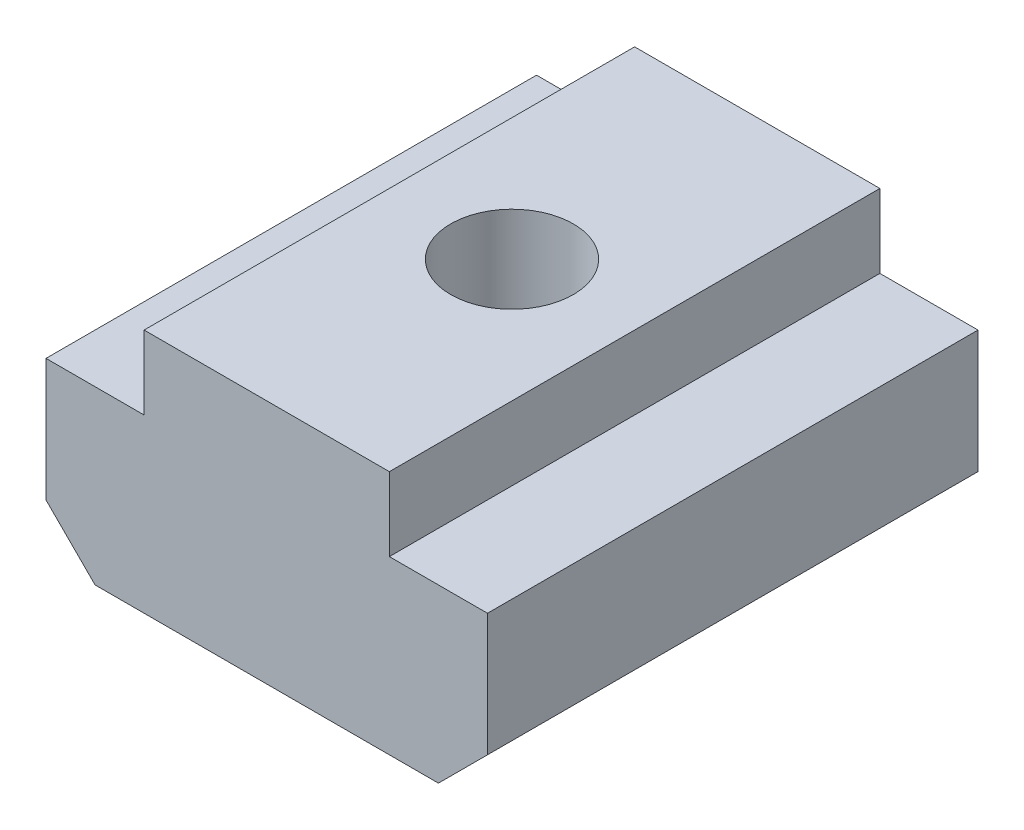
ISO-10303-21;
HEADER;
FILE_DESCRIPTION(('STEP AP214'),'2;1');
FILE_NAME('part.step','',(''),(''),'','','');
FILE_SCHEMA(('AUTOMOTIVE_DESIGN { 1 0 10303 214 1 1 1 1 }'));
ENDSEC;
DATA;
#1=APPLICATION_CONTEXT('core data for automotive mechanical design processes');
#2=APPLICATION_PROTOCOL_DEFINITION('international standard','automotive_design',2000,#1);
#3=PRODUCT_CONTEXT('',#1,'mechanical');
#4=PRODUCT('Part','Part','',(#3));
#5=PRODUCT_RELATED_PRODUCT_CATEGORY('part','',(#4));
#6=PRODUCT_DEFINITION_FORMATION('','',#4);
#7=PRODUCT_DEFINITION_CONTEXT('part definition',#1,'design');
#8=PRODUCT_DEFINITION('design','',#6,#7);
#9=PRODUCT_DEFINITION_SHAPE('','',#8);
#10=(LENGTH_UNIT() NAMED_UNIT(*) SI_UNIT(.MILLI.,.METRE.));
#11=(NAMED_UNIT(*) PLANE_ANGLE_UNIT() SI_UNIT($,.RADIAN.));
#12=(NAMED_UNIT(*) SI_UNIT($,.STERADIAN.) SOLID_ANGLE_UNIT());
#13=UNCERTAINTY_MEASURE_WITH_UNIT(LENGTH_MEASURE(1.E-05),#10,'distance_accuracy_value','');
#14=(GEOMETRIC_REPRESENTATION_CONTEXT(3) GLOBAL_UNCERTAINTY_ASSIGNED_CONTEXT((#13)) GLOBAL_UNIT_ASSIGNED_CONTEXT((#10,
#11,#12)) REPRESENTATION_CONTEXT('',''));
#15=CARTESIAN_POINT('',(0.,0.,0.));
#16=DIRECTION('',(0.,0.,1.));
#17=DIRECTION('',(1.,0.,0.));
#18=AXIS2_PLACEMENT_3D('',#15,#16,#17);
#19=CARTESIAN_POINT('',(-4.5,1.,10.));
#20=DIRECTION('',(0.707106781186547,0.707106781186548,0.));
#21=DIRECTION('',(-0.707106781186548,0.707106781186547,0.));
#22=AXIS2_PLACEMENT_3D('',#19,#20,#21);
#23=PLANE('',#22);
#24=DIRECTION('',(0.707106781186548,-0.707106781186547,0.));
#25=VECTOR('',#24,1.);
#26=CARTESIAN_POINT('',(-4.5,1.,0.));
#27=LINE('',#26,#25);
#28=CARTESIAN_POINT('',(-4.5,1.,0.));
#29=VERTEX_POINT('',#28);
#30=CARTESIAN_POINT('',(-3.5,0.,0.));
#31=VERTEX_POINT('',#30);
#32=EDGE_CURVE('E145',#29,#31,#27,.T.);
#33=ORIENTED_EDGE('',*,*,#32,.T.);
#34=DIRECTION('',(0.,0.,-1.));
#35=VECTOR('',#34,1.);
#36=CARTESIAN_POINT('',(-3.5,0.,10.));
#37=LINE('',#36,#35);
#38=CARTESIAN_POINT('',(-3.5,0.,10.));
#39=VERTEX_POINT('',#38);
#40=EDGE_CURVE('E11',#39,#31,#37,.T.);
#41=ORIENTED_EDGE('',*,*,#40,.F.);
#42=DIRECTION('',(0.707106781186548,-0.707106781186547,0.));
#43=VECTOR('',#42,1.);
#44=CARTESIAN_POINT('',(-4.5,1.,10.));
#45=LINE('',#44,#43);
#46=CARTESIAN_POINT('',(-4.5,1.,10.));
#47=VERTEX_POINT('',#46);
#48=EDGE_CURVE('E164',#47,#39,#45,.T.);
#49=ORIENTED_EDGE('',*,*,#48,.F.);
#50=DIRECTION('',(0.,0.,-1.));
#51=VECTOR('',#50,1.);
#52=CARTESIAN_POINT('',(-4.5,1.,10.));
#53=LINE('',#52,#51);
#54=EDGE_CURVE('E141',#47,#29,#53,.T.);
#55=ORIENTED_EDGE('',*,*,#54,.T.);
#56=EDGE_LOOP('',(#33,#41,#49,#55));
#57=FACE_BOUND('',#56,.T.);
#58=ADVANCED_FACE('F37',(#57),#23,.F.);
#59=CARTESIAN_POINT('',(-3.5,0.,10.));
#60=DIRECTION('',(0.,1.,0.));
#61=DIRECTION('',(0.,0.,1.));
#62=AXIS2_PLACEMENT_3D('',#59,#60,#61);
#63=PLANE('',#62);
#64=CARTESIAN_POINT('',(0.,0.,5.));
#65=DIRECTION('',(0.,1.,0.));
#66=DIRECTION('',(0.,0.,1.));
#67=AXIS2_PLACEMENT_3D('',#64,#65,#66);
#68=CIRCLE('',#67,1.25);
#69=CARTESIAN_POINT('',(0.,0.,6.25));
#70=VERTEX_POINT('',#69);
#71=EDGE_CURVE('E149',#70,#70,#68,.T.);
#72=ORIENTED_EDGE('',*,*,#71,.T.);
#73=EDGE_LOOP('',(#72));
#74=FACE_BOUND('',#73,.T.);
#75=DIRECTION('',(1.,0.,0.));
#76=VECTOR('',#75,1.);
#77=CARTESIAN_POINT('',(-3.5,0.,0.));
#78=LINE('',#77,#76);
#79=CARTESIAN_POINT('',(3.5,0.,0.));
#80=VERTEX_POINT('',#79);
#81=EDGE_CURVE('E148',#31,#80,#78,.T.);
#82=ORIENTED_EDGE('',*,*,#81,.T.);
#83=DIRECTION('',(0.,0.,-1.));
#84=VECTOR('',#83,1.);
#85=CARTESIAN_POINT('',(3.5,0.,10.));
#86=LINE('',#85,#84);
#87=CARTESIAN_POINT('',(3.5,0.,10.));
#88=VERTEX_POINT('',#87);
#89=EDGE_CURVE('E45',#88,#80,#86,.T.);
#90=ORIENTED_EDGE('',*,*,#89,.F.);
#91=DIRECTION('',(1.,0.,0.));
#92=VECTOR('',#91,1.);
#93=CARTESIAN_POINT('',(-3.5,0.,10.));
#94=LINE('',#93,#92);
#95=EDGE_CURVE('E102',#39,#88,#94,.T.);
#96=ORIENTED_EDGE('',*,*,#95,.F.);
#97=ORIENTED_EDGE('',*,*,#40,.T.);
#98=EDGE_LOOP('',(#82,#90,#96,#97));
#99=FACE_BOUND('',#98,.T.);
#100=ADVANCED_FACE('F240',(#74,#99),#63,.F.);
#101=CARTESIAN_POINT('',(3.5,0.,10.));
#102=DIRECTION('',(-0.707106781186547,0.707106781186548,0.));
#103=DIRECTION('',(-0.707106781186548,-0.707106781186547,0.));
#104=AXIS2_PLACEMENT_3D('',#101,#102,#103);
#105=PLANE('',#104);
#106=DIRECTION('',(0.707106781186548,0.707106781186547,0.));
#107=VECTOR('',#106,1.);
#108=CARTESIAN_POINT('',(3.5,0.,0.));
#109=LINE('',#108,#107);
#110=CARTESIAN_POINT('',(4.5,1.,0.));
#111=VERTEX_POINT('',#110);
#112=EDGE_CURVE('E151',#80,#111,#109,.T.);
#113=ORIENTED_EDGE('',*,*,#112,.T.);
#114=DIRECTION('',(0.,0.,-1.));
#115=VECTOR('',#114,1.);
#116=CARTESIAN_POINT('',(4.5,1.,10.));
#117=LINE('',#116,#115);
#118=CARTESIAN_POINT('',(4.5,1.,10.));
#119=VERTEX_POINT('',#118);
#120=EDGE_CURVE('E177',#119,#111,#117,.T.);
#121=ORIENTED_EDGE('',*,*,#120,.F.);
#122=DIRECTION('',(0.707106781186548,0.707106781186547,0.));
#123=VECTOR('',#122,1.);
#124=CARTESIAN_POINT('',(3.5,0.,10.));
#125=LINE('',#124,#123);
#126=EDGE_CURVE('E185',#88,#119,#125,.T.);
#127=ORIENTED_EDGE('',*,*,#126,.F.);
#128=ORIENTED_EDGE('',*,*,#89,.T.);
#129=EDGE_LOOP('',(#113,#121,#127,#128));
#130=FACE_BOUND('',#129,.T.);
#131=ADVANCED_FACE('F183',(#130),#105,.F.);
#132=CARTESIAN_POINT('',(4.5,1.,10.));
#133=DIRECTION('',(-1.,0.,0.));
#134=DIRECTION('',(0.,0.,1.));
#135=AXIS2_PLACEMENT_3D('',#132,#133,#134);
#136=PLANE('',#135);
#137=DIRECTION('',(0.,1.,0.));
#138=VECTOR('',#137,1.);
#139=CARTESIAN_POINT('',(4.5,1.,0.));
#140=LINE('',#139,#138);
#141=CARTESIAN_POINT('',(4.5,3.5,0.));
#142=VERTEX_POINT('',#141);
#143=EDGE_CURVE('E153',#111,#142,#140,.T.);
#144=ORIENTED_EDGE('',*,*,#143,.T.);
#145=DIRECTION('',(0.,0.,-1.));
#146=VECTOR('',#145,1.);
#147=CARTESIAN_POINT('',(4.5,3.5,10.));
#148=LINE('',#147,#146);
#149=CARTESIAN_POINT('',(4.5,3.5,10.));
#150=VERTEX_POINT('',#149);
#151=EDGE_CURVE('E174',#150,#142,#148,.T.);
#152=ORIENTED_EDGE('',*,*,#151,.F.);
#153=DIRECTION('',(0.,1.,0.));
#154=VECTOR('',#153,1.);
#155=CARTESIAN_POINT('',(4.5,1.,10.));
#156=LINE('',#155,#154);
#157=EDGE_CURVE('E203',#119,#150,#156,.T.);
#158=ORIENTED_EDGE('',*,*,#157,.F.);
#159=ORIENTED_EDGE('',*,*,#120,.T.);
#160=EDGE_LOOP('',(#144,#152,#158,#159));
#161=FACE_BOUND('',#160,.T.);
#162=ADVANCED_FACE('F194',(#161),#136,.F.);
#163=CARTESIAN_POINT('',(4.5,3.5,10.));
#164=DIRECTION('',(0.,-1.,0.));
#165=DIRECTION('',(1.,0.,0.));
#166=AXIS2_PLACEMENT_3D('',#163,#164,#165);
#167=PLANE('',#166);
#168=DIRECTION('',(-1.,0.,0.));
#169=VECTOR('',#168,1.);
#170=CARTESIAN_POINT('',(4.5,3.5,0.));
#171=LINE('',#170,#169);
#172=CARTESIAN_POINT('',(2.5,3.5,0.));
#173=VERTEX_POINT('',#172);
#174=EDGE_CURVE('E155',#142,#173,#171,.T.);
#175=ORIENTED_EDGE('',*,*,#174,.T.);
#176=DIRECTION('',(0.,0.,-1.));
#177=VECTOR('',#176,1.);
#178=CARTESIAN_POINT('',(2.5,3.5,10.));
#179=LINE('',#178,#177);
#180=CARTESIAN_POINT('',(2.5,3.5,10.));
#181=VERTEX_POINT('',#180);
#182=EDGE_CURVE('E171',#181,#173,#179,.T.);
#183=ORIENTED_EDGE('',*,*,#182,.F.);
#184=DIRECTION('',(-1.,0.,0.));
#185=VECTOR('',#184,1.);
#186=CARTESIAN_POINT('',(4.5,3.5,10.));
#187=LINE('',#186,#185);
#188=EDGE_CURVE('E200',#150,#181,#187,.T.);
#189=ORIENTED_EDGE('',*,*,#188,.F.);
#190=ORIENTED_EDGE('',*,*,#151,.T.);
#191=EDGE_LOOP('',(#175,#183,#189,#190));
#192=FACE_BOUND('',#191,.T.);
#193=ADVANCED_FACE('F198',(#192),#167,.F.);
#194=CARTESIAN_POINT('',(2.5,3.5,10.));
#195=DIRECTION('',(-1.,0.,0.));
#196=DIRECTION('',(0.,-1.,0.));
#197=AXIS2_PLACEMENT_3D('',#194,#195,#196);
#198=PLANE('',#197);
#199=DIRECTION('',(0.,1.,0.));
#200=VECTOR('',#199,1.);
#201=CARTESIAN_POINT('',(2.5,3.5,0.));
#202=LINE('',#201,#200);
#203=CARTESIAN_POINT('',(2.5,5.,0.));
#204=VERTEX_POINT('',#203);
#205=EDGE_CURVE('E157',#173,#204,#202,.T.);
#206=ORIENTED_EDGE('',*,*,#205,.T.);
#207=DIRECTION('',(0.,0.,-1.));
#208=VECTOR('',#207,1.);
#209=CARTESIAN_POINT('',(2.5,5.,10.));
#210=LINE('',#209,#208);
#211=CARTESIAN_POINT('',(2.5,5.,10.));
#212=VERTEX_POINT('',#211);
#213=EDGE_CURVE('E168',#212,#204,#210,.T.);
#214=ORIENTED_EDGE('',*,*,#213,.F.);
#215=DIRECTION('',(0.,1.,0.));
#216=VECTOR('',#215,1.);
#217=CARTESIAN_POINT('',(2.5,3.5,10.));
#218=LINE('',#217,#216);
#219=EDGE_CURVE('E202',#181,#212,#218,.T.);
#220=ORIENTED_EDGE('',*,*,#219,.F.);
#221=ORIENTED_EDGE('',*,*,#182,.T.);
#222=EDGE_LOOP('',(#206,#214,#220,#221));
#223=FACE_BOUND('',#222,.T.);
#224=ADVANCED_FACE('F222',(#223),#198,.F.);
#225=CARTESIAN_POINT('',(2.5,5.,10.));
#226=DIRECTION('',(0.,-1.,0.));
#227=DIRECTION('',(0.,0.,-1.));
#228=AXIS2_PLACEMENT_3D('',#225,#226,#227);
#229=PLANE('',#228);
#230=CARTESIAN_POINT('',(0.,5.,5.));
#231=DIRECTION('',(0.,1.,0.));
#232=DIRECTION('',(0.,0.,1.));
#233=AXIS2_PLACEMENT_3D('',#230,#231,#232);
#234=CIRCLE('',#233,1.25);
#235=CARTESIAN_POINT('',(0.,5.,6.25));
#236=VERTEX_POINT('',#235);
#237=EDGE_CURVE('E213',#236,#236,#234,.T.);
#238=ORIENTED_EDGE('',*,*,#237,.F.);
#239=EDGE_LOOP('',(#238));
#240=FACE_BOUND('',#239,.T.);
#241=DIRECTION('',(-1.,0.,0.));
#242=VECTOR('',#241,1.);
#243=CARTESIAN_POINT('',(2.5,5.,0.));
#244=LINE('',#243,#242);
#245=CARTESIAN_POINT('',(-2.5,5.,0.));
#246=VERTEX_POINT('',#245);
#247=EDGE_CURVE('E159',#204,#246,#244,.T.);
#248=ORIENTED_EDGE('',*,*,#247,.T.);
#249=DIRECTION('',(0.,0.,-1.));
#250=VECTOR('',#249,1.);
#251=CARTESIAN_POINT('',(-2.5,5.,10.));
#252=LINE('',#251,#250);
#253=CARTESIAN_POINT('',(-2.5,5.,10.));
#254=VERTEX_POINT('',#253);
#255=EDGE_CURVE('E136',#254,#246,#252,.T.);
#256=ORIENTED_EDGE('',*,*,#255,.F.);
#257=DIRECTION('',(-1.,0.,0.));
#258=VECTOR('',#257,1.);
#259=CARTESIAN_POINT('',(2.5,5.,10.));
#260=LINE('',#259,#258);
#261=EDGE_CURVE('E127',#212,#254,#260,.T.);
#262=ORIENTED_EDGE('',*,*,#261,.F.);
#263=ORIENTED_EDGE('',*,*,#213,.T.);
#264=EDGE_LOOP('',(#248,#256,#262,#263));
#265=FACE_BOUND('',#264,.T.);
#266=ADVANCED_FACE('F219',(#240,#265),#229,.F.);
#267=CARTESIAN_POINT('',(-2.5,5.,10.));
#268=DIRECTION('',(1.,0.,0.));
#269=DIRECTION('',(0.,1.,0.));
#270=AXIS2_PLACEMENT_3D('',#267,#268,#269);
#271=PLANE('',#270);
#272=DIRECTION('',(0.,-1.,0.));
#273=VECTOR('',#272,1.);
#274=CARTESIAN_POINT('',(-2.5,5.,0.));
#275=LINE('',#274,#273);
#276=CARTESIAN_POINT('',(-2.5,3.5,0.));
#277=VERTEX_POINT('',#276);
#278=EDGE_CURVE('E135',#246,#277,#275,.T.);
#279=ORIENTED_EDGE('',*,*,#278,.T.);
#280=DIRECTION('',(0.,0.,-1.));
#281=VECTOR('',#280,1.);
#282=CARTESIAN_POINT('',(-2.5,3.5,10.));
#283=LINE('',#282,#281);
#284=CARTESIAN_POINT('',(-2.5,3.5,10.));
#285=VERTEX_POINT('',#284);
#286=EDGE_CURVE('E132',#285,#277,#283,.T.);
#287=ORIENTED_EDGE('',*,*,#286,.F.);
#288=DIRECTION('',(0.,-1.,0.));
#289=VECTOR('',#288,1.);
#290=CARTESIAN_POINT('',(-2.5,5.,10.));
#291=LINE('',#290,#289);
#292=EDGE_CURVE('E121',#254,#285,#291,.T.);
#293=ORIENTED_EDGE('',*,*,#292,.F.);
#294=ORIENTED_EDGE('',*,*,#255,.T.);
#295=EDGE_LOOP('',(#279,#287,#293,#294));
#296=FACE_BOUND('',#295,.T.);
#297=ADVANCED_FACE('F133',(#296),#271,.F.);
#298=CARTESIAN_POINT('',(-2.5,3.5,10.));
#299=DIRECTION('',(0.,-1.,0.));
#300=DIRECTION('',(0.,0.,-1.));
#301=AXIS2_PLACEMENT_3D('',#298,#299,#300);
#302=PLANE('',#301);
#303=DIRECTION('',(-1.,0.,0.));
#304=VECTOR('',#303,1.);
#305=CARTESIAN_POINT('',(-2.5,3.5,0.));
#306=LINE('',#305,#304);
#307=CARTESIAN_POINT('',(-4.5,3.5,0.));
#308=VERTEX_POINT('',#307);
#309=EDGE_CURVE('E88',#277,#308,#306,.T.);
#310=ORIENTED_EDGE('',*,*,#309,.T.);
#311=DIRECTION('',(0.,0.,-1.));
#312=VECTOR('',#311,1.);
#313=CARTESIAN_POINT('',(-4.5,3.5,10.));
#314=LINE('',#313,#312);
#315=CARTESIAN_POINT('',(-4.5,3.5,10.));
#316=VERTEX_POINT('',#315);
#317=EDGE_CURVE('E137',#316,#308,#314,.T.);
#318=ORIENTED_EDGE('',*,*,#317,.F.);
#319=DIRECTION('',(-1.,0.,0.));
#320=VECTOR('',#319,1.);
#321=CARTESIAN_POINT('',(-2.5,3.5,10.));
#322=LINE('',#321,#320);
#323=EDGE_CURVE('E125',#285,#316,#322,.T.);
#324=ORIENTED_EDGE('',*,*,#323,.F.);
#325=ORIENTED_EDGE('',*,*,#286,.T.);
#326=EDGE_LOOP('',(#310,#318,#324,#325));
#327=FACE_BOUND('',#326,.T.);
#328=ADVANCED_FACE('F139',(#327),#302,.F.);
#329=CARTESIAN_POINT('',(-4.5,3.5,10.));
#330=DIRECTION('',(1.,0.,0.));
#331=DIRECTION('',(0.,0.,-1.));
#332=AXIS2_PLACEMENT_3D('',#329,#330,#331);
#333=PLANE('',#332);
#334=DIRECTION('',(0.,-1.,0.));
#335=VECTOR('',#334,1.);
#336=CARTESIAN_POINT('',(-4.5,3.5,0.));
#337=LINE('',#336,#335);
#338=EDGE_CURVE('E94',#308,#29,#337,.T.);
#339=ORIENTED_EDGE('',*,*,#338,.T.);
#340=ORIENTED_EDGE('',*,*,#54,.F.);
#341=DIRECTION('',(0.,-1.,0.));
#342=VECTOR('',#341,1.);
#343=CARTESIAN_POINT('',(-4.5,3.5,10.));
#344=LINE('',#343,#342);
#345=EDGE_CURVE('E53',#316,#47,#344,.T.);
#346=ORIENTED_EDGE('',*,*,#345,.F.);
#347=ORIENTED_EDGE('',*,*,#317,.T.);
#348=EDGE_LOOP('',(#339,#340,#346,#347));
#349=FACE_BOUND('',#348,.T.);
#350=ADVANCED_FACE('F229',(#349),#333,.F.);
#351=CARTESIAN_POINT('',(0.,0.,10.));
#352=DIRECTION('',(0.,0.,1.));
#353=DIRECTION('',(1.,0.,0.));
#354=AXIS2_PLACEMENT_3D('',#351,#352,#353);
#355=PLANE('',#354);
#356=ORIENTED_EDGE('',*,*,#48,.T.);
#357=ORIENTED_EDGE('',*,*,#95,.T.);
#358=ORIENTED_EDGE('',*,*,#126,.T.);
#359=ORIENTED_EDGE('',*,*,#157,.T.);
#360=ORIENTED_EDGE('',*,*,#188,.T.);
#361=ORIENTED_EDGE('',*,*,#219,.T.);
#362=ORIENTED_EDGE('',*,*,#261,.T.);
#363=ORIENTED_EDGE('',*,*,#292,.T.);
#364=ORIENTED_EDGE('',*,*,#323,.T.);
#365=ORIENTED_EDGE('',*,*,#345,.T.);
#366=EDGE_LOOP('',(#356,#357,#358,#359,#360,#361,#362,#363,#364,#365));
#367=FACE_BOUND('',#366,.T.);
#368=ADVANCED_FACE('F123',(#367),#355,.T.);
#369=CARTESIAN_POINT('',(0.,0.,0.));
#370=DIRECTION('',(0.,0.,1.));
#371=DIRECTION('',(1.,0.,0.));
#372=AXIS2_PLACEMENT_3D('',#369,#370,#371);
#373=PLANE('',#372);
#374=ORIENTED_EDGE('',*,*,#32,.F.);
#375=ORIENTED_EDGE('',*,*,#338,.F.);
#376=ORIENTED_EDGE('',*,*,#309,.F.);
#377=ORIENTED_EDGE('',*,*,#278,.F.);
#378=ORIENTED_EDGE('',*,*,#247,.F.);
#379=ORIENTED_EDGE('',*,*,#205,.F.);
#380=ORIENTED_EDGE('',*,*,#174,.F.);
#381=ORIENTED_EDGE('',*,*,#143,.F.);
#382=ORIENTED_EDGE('',*,*,#112,.F.);
#383=ORIENTED_EDGE('',*,*,#81,.F.);
#384=EDGE_LOOP('',(#374,#375,#376,#377,#378,#379,#380,#381,#382,#383));
#385=FACE_BOUND('',#384,.T.);
#386=ADVANCED_FACE('F189',(#385),#373,.F.);
#387=CARTESIAN_POINT('',(0.,5.,5.));
#388=DIRECTION('',(0.,1.,0.));
#389=DIRECTION('',(0.,0.,1.));
#390=AXIS2_PLACEMENT_3D('',#387,#388,#389);
#391=CYLINDRICAL_SURFACE('',#390,1.25);
#392=ORIENTED_EDGE('',*,*,#71,.F.);
#393=EDGE_LOOP('',(#392));
#394=FACE_BOUND('',#393,.T.);
#395=ORIENTED_EDGE('',*,*,#237,.T.);
#396=EDGE_LOOP('',(#395));
#397=FACE_BOUND('',#396,.T.);
#398=ADVANCED_FACE('F217',(#394,#397),#391,.F.);
#399=CLOSED_SHELL('',(#58,#100,#131,#162,#193,#224,#266,#297,#328,#350,#368,#386,#398));
#400=MANIFOLD_SOLID_BREP('B2',#399);
#401=ADVANCED_BREP_SHAPE_REPRESENTATION('',(#18,#400),#14);
#402=SHAPE_DEFINITION_REPRESENTATION(#9,#401);
ENDSEC;
END-ISO-10303-21;
